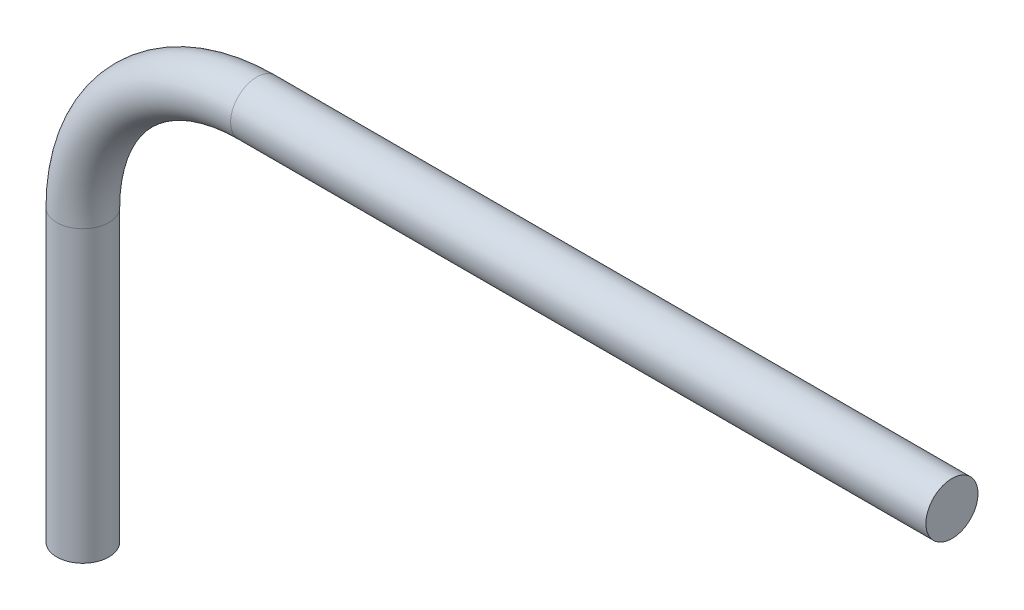
ISO-10303-21;
HEADER;
FILE_DESCRIPTION(('STEP AP214'),'2;1');
FILE_NAME('part.step','',(''),(''),'','','');
FILE_SCHEMA(('AUTOMOTIVE_DESIGN { 1 0 10303 214 1 1 1 1 }'));
ENDSEC;
DATA;
#1=APPLICATION_CONTEXT('core data for automotive mechanical design processes');
#2=APPLICATION_PROTOCOL_DEFINITION('international standard','automotive_design',2000,#1);
#3=PRODUCT_CONTEXT('',#1,'mechanical');
#4=PRODUCT('Part','Part','',(#3));
#5=PRODUCT_RELATED_PRODUCT_CATEGORY('part','',(#4));
#6=PRODUCT_DEFINITION_FORMATION('','',#4);
#7=PRODUCT_DEFINITION_CONTEXT('part definition',#1,'design');
#8=PRODUCT_DEFINITION('design','',#6,#7);
#9=PRODUCT_DEFINITION_SHAPE('','',#8);
#10=(LENGTH_UNIT() NAMED_UNIT(*) SI_UNIT(.MILLI.,.METRE.));
#11=(NAMED_UNIT(*) PLANE_ANGLE_UNIT() SI_UNIT($,.RADIAN.));
#12=(NAMED_UNIT(*) SI_UNIT($,.STERADIAN.) SOLID_ANGLE_UNIT());
#13=UNCERTAINTY_MEASURE_WITH_UNIT(LENGTH_MEASURE(1.E-05),#10,'distance_accuracy_value','');
#14=(GEOMETRIC_REPRESENTATION_CONTEXT(3) GLOBAL_UNCERTAINTY_ASSIGNED_CONTEXT((#13)) GLOBAL_UNIT_ASSIGNED_CONTEXT((#10,
#11,#12)) REPRESENTATION_CONTEXT('',''));
#15=CARTESIAN_POINT('',(0.,0.,0.));
#16=DIRECTION('',(0.,0.,1.));
#17=DIRECTION('',(1.,0.,0.));
#18=AXIS2_PLACEMENT_3D('',#15,#16,#17);
#19=CARTESIAN_POINT('',(0.,0.,0.));
#20=DIRECTION('',(0.,-1.,0.));
#21=DIRECTION('',(0.,0.,1.));
#22=AXIS2_PLACEMENT_3D('',#19,#20,#21);
#23=PLANE('',#22);
#24=CARTESIAN_POINT('',(0.,0.,0.));
#25=DIRECTION('',(0.,-1.,0.));
#26=DIRECTION('',(0.,0.,1.));
#27=AXIS2_PLACEMENT_3D('',#24,#25,#26);
#28=CIRCLE('',#27,4.5);
#29=CARTESIAN_POINT('',(0.,0.,4.5));
#30=VERTEX_POINT('',#29);
#31=EDGE_CURVE('E75',#30,#30,#28,.T.);
#32=ORIENTED_EDGE('',*,*,#31,.T.);
#33=EDGE_LOOP('',(#32));
#34=FACE_BOUND('',#33,.T.);
#35=ADVANCED_FACE('F54',(#34),#23,.T.);
#36=CARTESIAN_POINT('',(150.,80.,0.));
#37=DIRECTION('',(-1.,0.,0.));
#38=DIRECTION('',(0.,0.,1.));
#39=AXIS2_PLACEMENT_3D('',#36,#37,#38);
#40=PLANE('',#39);
#41=CARTESIAN_POINT('',(150.,80.,0.));
#42=DIRECTION('',(-1.,0.,0.));
#43=DIRECTION('',(0.,0.,1.));
#44=AXIS2_PLACEMENT_3D('',#41,#42,#43);
#45=CIRCLE('',#44,4.5);
#46=CARTESIAN_POINT('',(150.,80.,4.5));
#47=VERTEX_POINT('',#46);
#48=EDGE_CURVE('E11',#47,#47,#45,.T.);
#49=ORIENTED_EDGE('',*,*,#48,.F.);
#50=EDGE_LOOP('',(#49));
#51=FACE_BOUND('',#50,.T.);
#52=ADVANCED_FACE('F88',(#51),#40,.F.);
#53=CARTESIAN_POINT('',(0.,0.,0.));
#54=DIRECTION('',(0.,1.,0.));
#55=DIRECTION('',(0.,0.,1.));
#56=AXIS2_PLACEMENT_3D('',#53,#54,#55);
#57=CYLINDRICAL_SURFACE('',#56,4.5);
#58=CARTESIAN_POINT('',(0.,49.9999999999998,0.));
#59=DIRECTION('',(0.,-1.,0.));
#60=DIRECTION('',(0.,0.,1.));
#61=AXIS2_PLACEMENT_3D('',#58,#59,#60);
#62=CIRCLE('',#61,4.5);
#63=CARTESIAN_POINT('',(-4.49999999999999,49.9999999999998,0.));
#64=VERTEX_POINT('',#63);
#65=EDGE_CURVE('E68',#64,#64,#62,.T.);
#66=ORIENTED_EDGE('',*,*,#65,.T.);
#67=EDGE_LOOP('',(#66));
#68=FACE_BOUND('',#67,.T.);
#69=ORIENTED_EDGE('',*,*,#31,.F.);
#70=EDGE_LOOP('',(#69));
#71=FACE_BOUND('',#70,.T.);
#72=ADVANCED_FACE('F85',(#68,#71),#57,.T.);
#73=CARTESIAN_POINT('',(30.,50.,0.));
#74=DIRECTION('',(0.,0.,-1.));
#75=DIRECTION('',(-1.,0.,0.));
#76=AXIS2_PLACEMENT_3D('',#73,#74,#75);
#77=TOROIDAL_SURFACE('',#76,30.,4.5);
#78=CARTESIAN_POINT('',(29.9999999999997,80.0000000000011,0.));
#79=DIRECTION('',(-1.,0.,0.));
#80=DIRECTION('',(0.,0.,1.));
#81=AXIS2_PLACEMENT_3D('',#78,#79,#80);
#82=CIRCLE('',#81,4.5);
#83=CARTESIAN_POINT('',(29.9999999999996,84.5,0.));
#84=VERTEX_POINT('',#83);
#85=EDGE_CURVE('E61',#84,#84,#82,.T.);
#86=CARTESIAN_POINT('',(30.,50.,0.));
#87=DIRECTION('',(0.,0.,-1.));
#88=DIRECTION('',(-1.,0.,0.));
#89=AXIS2_PLACEMENT_3D('',#86,#87,#88);
#90=CIRCLE('',#89,34.5);
#91=EDGE_CURVE('',#64,#84,#90,.T.);
#92=ORIENTED_EDGE('',*,*,#65,.F.);
#93=ORIENTED_EDGE('',*,*,#85,.T.);
#94=ORIENTED_EDGE('',*,*,#91,.T.);
#95=ORIENTED_EDGE('',*,*,#91,.F.);
#96=EDGE_LOOP('',(#92,#94,#93,#95));
#97=FACE_BOUND('',#96,.T.);
#98=ADVANCED_FACE('F87',(#97),#77,.T.);
#99=CARTESIAN_POINT('',(30.0000000000002,80.,0.));
#100=DIRECTION('',(1.,0.,0.));
#101=DIRECTION('',(0.,0.,-1.));
#102=AXIS2_PLACEMENT_3D('',#99,#100,#101);
#103=CYLINDRICAL_SURFACE('',#102,4.5);
#104=ORIENTED_EDGE('',*,*,#48,.T.);
#105=EDGE_LOOP('',(#104));
#106=FACE_BOUND('',#105,.T.);
#107=ORIENTED_EDGE('',*,*,#85,.F.);
#108=EDGE_LOOP('',(#107));
#109=FACE_BOUND('',#108,.T.);
#110=ADVANCED_FACE('F95',(#106,#109),#103,.T.);
#111=CLOSED_SHELL('',(#35,#52,#72,#98,#110));
#112=MANIFOLD_SOLID_BREP('B2',#111);
#113=ADVANCED_BREP_SHAPE_REPRESENTATION('',(#18,#112),#14);
#114=SHAPE_DEFINITION_REPRESENTATION(#9,#113);
ENDSEC;
END-ISO-10303-21;
